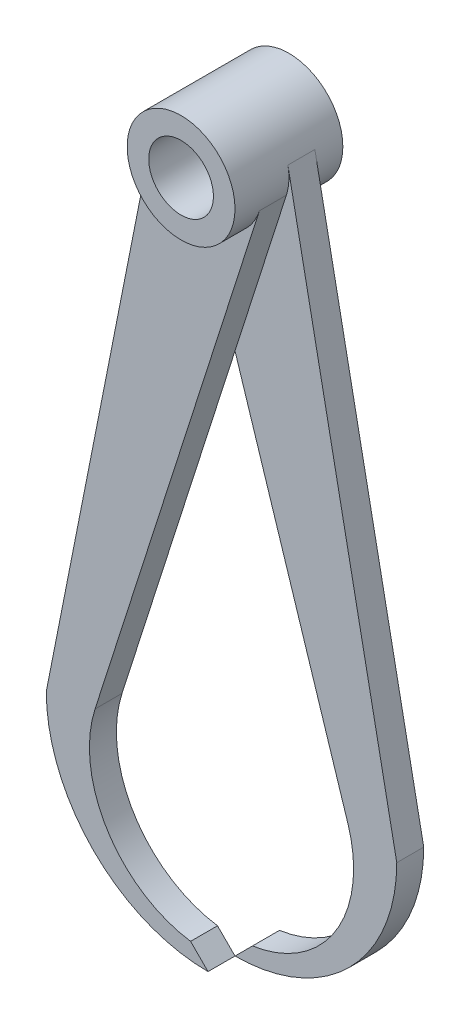
ISO-10303-21;
HEADER;
FILE_DESCRIPTION(('STEP AP214'),'2;1');
FILE_NAME('part.step','',(''),(''),'','','');
FILE_SCHEMA(('AUTOMOTIVE_DESIGN { 1 0 10303 214 1 1 1 1 }'));
ENDSEC;
DATA;
#1=APPLICATION_CONTEXT('core data for automotive mechanical design processes');
#2=APPLICATION_PROTOCOL_DEFINITION('international standard','automotive_design',2000,#1);
#3=PRODUCT_CONTEXT('',#1,'mechanical');
#4=PRODUCT('Part','Part','',(#3));
#5=PRODUCT_RELATED_PRODUCT_CATEGORY('part','',(#4));
#6=PRODUCT_DEFINITION_FORMATION('','',#4);
#7=PRODUCT_DEFINITION_CONTEXT('part definition',#1,'design');
#8=PRODUCT_DEFINITION('design','',#6,#7);
#9=PRODUCT_DEFINITION_SHAPE('','',#8);
#10=(LENGTH_UNIT() NAMED_UNIT(*) SI_UNIT(.MILLI.,.METRE.));
#11=(NAMED_UNIT(*) PLANE_ANGLE_UNIT() SI_UNIT($,.RADIAN.));
#12=(NAMED_UNIT(*) SI_UNIT($,.STERADIAN.) SOLID_ANGLE_UNIT());
#13=UNCERTAINTY_MEASURE_WITH_UNIT(LENGTH_MEASURE(1.E-05),#10,'distance_accuracy_value','');
#14=(GEOMETRIC_REPRESENTATION_CONTEXT(3) GLOBAL_UNCERTAINTY_ASSIGNED_CONTEXT((#13)) GLOBAL_UNIT_ASSIGNED_CONTEXT((#10,
#11,#12)) REPRESENTATION_CONTEXT('',''));
#15=CARTESIAN_POINT('',(0.,0.,0.));
#16=DIRECTION('',(0.,0.,1.));
#17=DIRECTION('',(1.,0.,0.));
#18=AXIS2_PLACEMENT_3D('',#15,#16,#17);
#19=CARTESIAN_POINT('',(65.,-65.0000000000001,-5.));
#20=DIRECTION('',(0.707106781186547,-0.707106781186548,0.));
#21=DIRECTION('',(0.707106781186548,0.707106781186547,0.));
#22=AXIS2_PLACEMENT_3D('',#19,#20,#21);
#23=PLANE('',#22);
#24=DIRECTION('',(0.707106781186548,0.707106781186547,0.));
#25=VECTOR('',#24,1.);
#26=CARTESIAN_POINT('',(65.,-65.0000000000001,0.));
#27=LINE('',#26,#25);
#28=CARTESIAN_POINT('',(0.,-130.,0.));
#29=VERTEX_POINT('',#28);
#30=CARTESIAN_POINT('',(3.23987041127394,-126.760129588726,0.));
#31=VERTEX_POINT('',#30);
#32=EDGE_CURVE('E141',#29,#31,#27,.T.);
#33=ORIENTED_EDGE('',*,*,#32,.T.);
#34=DIRECTION('',(0.,0.,1.));
#35=VECTOR('',#34,1.);
#36=CARTESIAN_POINT('',(3.23987041127394,-126.760129588726,-5.));
#37=LINE('',#36,#35);
#38=CARTESIAN_POINT('',(3.23987041127394,-126.760129588726,-5.));
#39=VERTEX_POINT('',#38);
#40=EDGE_CURVE('E12',#39,#31,#37,.T.);
#41=ORIENTED_EDGE('',*,*,#40,.F.);
#42=DIRECTION('',(0.707106781186548,0.707106781186547,0.));
#43=VECTOR('',#42,1.);
#44=CARTESIAN_POINT('',(65.,-65.0000000000001,-5.));
#45=LINE('',#44,#43);
#46=CARTESIAN_POINT('',(0.,-130.,-5.));
#47=VERTEX_POINT('',#46);
#48=EDGE_CURVE('E153',#47,#39,#45,.T.);
#49=ORIENTED_EDGE('',*,*,#48,.F.);
#50=DIRECTION('',(0.,0.,1.));
#51=VECTOR('',#50,1.);
#52=CARTESIAN_POINT('',(0.,-130.,-5.));
#53=LINE('',#52,#51);
#54=EDGE_CURVE('E59',#47,#29,#53,.T.);
#55=ORIENTED_EDGE('',*,*,#54,.T.);
#56=EDGE_LOOP('',(#33,#41,#49,#55));
#57=FACE_BOUND('',#56,.T.);
#58=ADVANCED_FACE('F56',(#57),#23,.F.);
#59=CARTESIAN_POINT('',(0.,-105.,-5.));
#60=DIRECTION('',(0.,0.,1.));
#61=DIRECTION('',(1.,0.,0.));
#62=AXIS2_PLACEMENT_3D('',#59,#60,#61);
#63=CYLINDRICAL_SURFACE('',#62,22.);
#64=CARTESIAN_POINT('',(0.,-105.,0.));
#65=DIRECTION('',(0.,0.,1.));
#66=DIRECTION('',(1.,0.,0.));
#67=AXIS2_PLACEMENT_3D('',#64,#65,#66);
#68=CIRCLE('',#67,22.);
#69=CARTESIAN_POINT('',(20.9534285452394,-98.2952380952381,0.));
#70=VERTEX_POINT('',#69);
#71=EDGE_CURVE('E93',#31,#70,#68,.T.);
#72=ORIENTED_EDGE('',*,*,#71,.T.);
#73=DIRECTION('',(0.,0.,1.));
#74=VECTOR('',#73,1.);
#75=CARTESIAN_POINT('',(20.9534285452394,-98.2952380952381,-5.));
#76=LINE('',#75,#74);
#77=CARTESIAN_POINT('',(20.9534285452394,-98.2952380952381,-5.));
#78=VERTEX_POINT('',#77);
#79=EDGE_CURVE('E65',#78,#70,#76,.T.);
#80=ORIENTED_EDGE('',*,*,#79,.F.);
#81=CARTESIAN_POINT('',(0.,-105.,-5.));
#82=DIRECTION('',(0.,0.,1.));
#83=DIRECTION('',(1.,0.,0.));
#84=AXIS2_PLACEMENT_3D('',#81,#82,#83);
#85=CIRCLE('',#84,22.);
#86=EDGE_CURVE('E73',#39,#78,#85,.T.);
#87=ORIENTED_EDGE('',*,*,#86,.F.);
#88=ORIENTED_EDGE('',*,*,#40,.T.);
#89=EDGE_LOOP('',(#72,#80,#87,#88));
#90=FACE_BOUND('',#89,.T.);
#91=ADVANCED_FACE('F173',(#90),#63,.F.);
#92=CARTESIAN_POINT('',(-9.52428570238155,-3.04761904761905,-5.));
#93=DIRECTION('',(0.952428570238155,0.304761904761905,0.));
#94=DIRECTION('',(-0.304761904761905,0.952428570238155,0.));
#95=AXIS2_PLACEMENT_3D('',#92,#93,#94);
#96=PLANE('',#95);
#97=DIRECTION('',(-0.304761904761905,0.952428570238155,0.));
#98=VECTOR('',#97,1.);
#99=CARTESIAN_POINT('',(-9.52428570238155,-3.04761904761905,0.));
#100=LINE('',#99,#98);
#101=CARTESIAN_POINT('',(-9.52428570238155,-3.04761904761905,0.));
#102=VERTEX_POINT('',#101);
#103=EDGE_CURVE('E126',#70,#102,#100,.T.);
#104=ORIENTED_EDGE('',*,*,#103,.T.);
#105=DIRECTION('',(0.,0.,1.));
#106=VECTOR('',#105,1.);
#107=CARTESIAN_POINT('',(-9.52428570238155,-3.04761904761905,-5.));
#108=LINE('',#107,#106);
#109=CARTESIAN_POINT('',(-9.52428570238155,-3.04761904761905,-5.));
#110=VERTEX_POINT('',#109);
#111=EDGE_CURVE('E124',#110,#102,#108,.T.);
#112=ORIENTED_EDGE('',*,*,#111,.F.);
#113=DIRECTION('',(-0.304761904761905,0.952428570238155,0.));
#114=VECTOR('',#113,1.);
#115=CARTESIAN_POINT('',(-9.52428570238155,-3.04761904761905,-5.));
#116=LINE('',#115,#114);
#117=EDGE_CURVE('E114',#78,#110,#116,.T.);
#118=ORIENTED_EDGE('',*,*,#117,.F.);
#119=ORIENTED_EDGE('',*,*,#79,.T.);
#120=EDGE_LOOP('',(#104,#112,#118,#119));
#121=FACE_BOUND('',#120,.T.);
#122=ADVANCED_FACE('F125',(#121),#96,.F.);
#123=CARTESIAN_POINT('',(0.,0.,-5.));
#124=DIRECTION('',(0.,0.,1.));
#125=DIRECTION('',(1.,0.,0.));
#126=AXIS2_PLACEMENT_3D('',#123,#124,#125);
#127=CYLINDRICAL_SURFACE('',#126,10.);
#128=CARTESIAN_POINT('',(0.,0.,0.));
#129=DIRECTION('',(0.,0.,1.));
#130=DIRECTION('',(1.,0.,0.));
#131=AXIS2_PLACEMENT_3D('',#128,#129,#130);
#132=CIRCLE('',#131,10.);
#133=CARTESIAN_POINT('',(9.80945398661768,1.9428361959853,0.));
#134=VERTEX_POINT('',#133);
#135=EDGE_CURVE('E150',#102,#134,#132,.T.);
#136=ORIENTED_EDGE('',*,*,#135,.T.);
#137=DIRECTION('',(0.,0.,1.));
#138=VECTOR('',#137,1.);
#139=CARTESIAN_POINT('',(9.80945398661768,1.9428361959853,-5.));
#140=LINE('',#139,#138);
#141=CARTESIAN_POINT('',(9.80945398661768,1.9428361959853,-5.));
#142=VERTEX_POINT('',#141);
#143=EDGE_CURVE('E130',#142,#134,#140,.T.);
#144=ORIENTED_EDGE('',*,*,#143,.F.);
#145=CARTESIAN_POINT('',(0.,0.,-5.));
#146=DIRECTION('',(0.,0.,1.));
#147=DIRECTION('',(1.,0.,0.));
#148=AXIS2_PLACEMENT_3D('',#145,#146,#147);
#149=CIRCLE('',#148,10.);
#150=EDGE_CURVE('E119',#110,#142,#149,.T.);
#151=ORIENTED_EDGE('',*,*,#150,.F.);
#152=ORIENTED_EDGE('',*,*,#111,.T.);
#153=EDGE_LOOP('',(#136,#144,#151,#152));
#154=FACE_BOUND('',#153,.T.);
#155=ADVANCED_FACE('F132',(#154),#127,.F.);
#156=CARTESIAN_POINT('',(9.80945398661768,1.9428361959853,-5.));
#157=DIRECTION('',(0.980945398661767,0.19428361959853,0.));
#158=DIRECTION('',(-0.19428361959853,0.980945398661767,0.));
#159=AXIS2_PLACEMENT_3D('',#156,#157,#158);
#160=PLANE('',#159);
#161=DIRECTION('',(-0.19428361959853,0.980945398661767,0.));
#162=VECTOR('',#161,1.);
#163=CARTESIAN_POINT('',(9.80945398661768,1.9428361959853,0.));
#164=LINE('',#163,#162);
#165=CARTESIAN_POINT('',(30.,-100.,0.));
#166=VERTEX_POINT('',#165);
#167=EDGE_CURVE('E147',#166,#134,#164,.T.);
#168=ORIENTED_EDGE('',*,*,#167,.F.);
#169=DIRECTION('',(0.,0.,1.));
#170=VECTOR('',#169,1.);
#171=CARTESIAN_POINT('',(30.,-100.,-5.));
#172=LINE('',#171,#170);
#173=CARTESIAN_POINT('',(30.,-100.,-5.));
#174=VERTEX_POINT('',#173);
#175=EDGE_CURVE('E156',#174,#166,#172,.T.);
#176=ORIENTED_EDGE('',*,*,#175,.F.);
#177=DIRECTION('',(-0.19428361959853,0.980945398661767,0.));
#178=VECTOR('',#177,1.);
#179=CARTESIAN_POINT('',(9.80945398661768,1.9428361959853,-5.));
#180=LINE('',#179,#178);
#181=EDGE_CURVE('E134',#174,#142,#180,.T.);
#182=ORIENTED_EDGE('',*,*,#181,.T.);
#183=ORIENTED_EDGE('',*,*,#143,.T.);
#184=EDGE_LOOP('',(#168,#176,#182,#183));
#185=FACE_BOUND('',#184,.T.);
#186=ADVANCED_FACE('F164',(#185),#160,.T.);
#187=CARTESIAN_POINT('',(0.,-100.,-5.));
#188=DIRECTION('',(0.,0.,1.));
#189=DIRECTION('',(1.,0.,0.));
#190=AXIS2_PLACEMENT_3D('',#187,#188,#189);
#191=CYLINDRICAL_SURFACE('',#190,30.);
#192=CARTESIAN_POINT('',(0.,-100.,0.));
#193=DIRECTION('',(0.,0.,1.));
#194=DIRECTION('',(1.,0.,0.));
#195=AXIS2_PLACEMENT_3D('',#192,#193,#194);
#196=CIRCLE('',#195,30.);
#197=EDGE_CURVE('E144',#29,#166,#196,.T.);
#198=ORIENTED_EDGE('',*,*,#197,.F.);
#199=ORIENTED_EDGE('',*,*,#54,.F.);
#200=CARTESIAN_POINT('',(0.,-100.,-5.));
#201=DIRECTION('',(0.,0.,1.));
#202=DIRECTION('',(1.,0.,0.));
#203=AXIS2_PLACEMENT_3D('',#200,#201,#202);
#204=CIRCLE('',#203,30.);
#205=EDGE_CURVE('E136',#47,#174,#204,.T.);
#206=ORIENTED_EDGE('',*,*,#205,.T.);
#207=ORIENTED_EDGE('',*,*,#175,.T.);
#208=EDGE_LOOP('',(#198,#199,#206,#207));
#209=FACE_BOUND('',#208,.T.);
#210=ADVANCED_FACE('F162',(#209),#191,.T.);
#211=CARTESIAN_POINT('',(0.,0.,-5.));
#212=DIRECTION('',(0.,0.,1.));
#213=DIRECTION('',(1.,0.,0.));
#214=AXIS2_PLACEMENT_3D('',#211,#212,#213);
#215=PLANE('',#214);
#216=ORIENTED_EDGE('',*,*,#48,.T.);
#217=ORIENTED_EDGE('',*,*,#86,.T.);
#218=ORIENTED_EDGE('',*,*,#117,.T.);
#219=ORIENTED_EDGE('',*,*,#150,.T.);
#220=ORIENTED_EDGE('',*,*,#181,.F.);
#221=ORIENTED_EDGE('',*,*,#205,.F.);
#222=EDGE_LOOP('',(#216,#217,#218,#219,#220,#221));
#223=FACE_BOUND('',#222,.T.);
#224=ADVANCED_FACE('F116',(#223),#215,.F.);
#225=CARTESIAN_POINT('',(0.,0.,0.));
#226=DIRECTION('',(0.,0.,1.));
#227=DIRECTION('',(1.,0.,0.));
#228=AXIS2_PLACEMENT_3D('',#225,#226,#227);
#229=PLANE('',#228);
#230=ORIENTED_EDGE('',*,*,#32,.F.);
#231=ORIENTED_EDGE('',*,*,#197,.T.);
#232=ORIENTED_EDGE('',*,*,#167,.T.);
#233=ORIENTED_EDGE('',*,*,#135,.F.);
#234=ORIENTED_EDGE('',*,*,#103,.F.);
#235=ORIENTED_EDGE('',*,*,#71,.F.);
#236=EDGE_LOOP('',(#230,#231,#232,#233,#234,#235));
#237=FACE_BOUND('',#236,.T.);
#238=ADVANCED_FACE('F161',(#237),#229,.T.);
#239=CLOSED_SHELL('',(#58,#91,#122,#155,#186,#210,#224,#238));
#240=MANIFOLD_SOLID_BREP('B2',#239);
#241=CARTESIAN_POINT('',(0.,-105.,5.));
#242=DIRECTION('',(0.,0.,-1.));
#243=DIRECTION('',(-1.,0.,0.));
#244=AXIS2_PLACEMENT_3D('',#241,#242,#243);
#245=CYLINDRICAL_SURFACE('',#244,22.);
#246=CARTESIAN_POINT('',(0.,-105.,0.));
#247=DIRECTION('',(0.,0.,1.));
#248=DIRECTION('',(1.,0.,0.));
#249=AXIS2_PLACEMENT_3D('',#246,#247,#248);
#250=CIRCLE('',#249,22.);
#251=CARTESIAN_POINT('',(-20.9534285452394,-98.2952380952381,0.));
#252=VERTEX_POINT('',#251);
#253=CARTESIAN_POINT('',(-3.23987041127394,-126.760129588726,0.));
#254=VERTEX_POINT('',#253);
#255=EDGE_CURVE('E349',#252,#254,#250,.T.);
#256=ORIENTED_EDGE('',*,*,#255,.F.);
#257=DIRECTION('',(0.,0.,-1.));
#258=VECTOR('',#257,1.);
#259=CARTESIAN_POINT('',(-20.9534285452394,-98.2952380952381,5.));
#260=LINE('',#259,#258);
#261=CARTESIAN_POINT('',(-20.9534285452394,-98.2952380952381,5.));
#262=VERTEX_POINT('',#261);
#263=EDGE_CURVE('E54',#262,#252,#260,.T.);
#264=ORIENTED_EDGE('',*,*,#263,.F.);
#265=CARTESIAN_POINT('',(0.,-105.,5.));
#266=DIRECTION('',(0.,0.,1.));
#267=DIRECTION('',(1.,0.,0.));
#268=AXIS2_PLACEMENT_3D('',#265,#266,#267);
#269=CIRCLE('',#268,22.);
#270=CARTESIAN_POINT('',(-3.23987041127394,-126.760129588726,5.));
#271=VERTEX_POINT('',#270);
#272=EDGE_CURVE('E368',#262,#271,#269,.T.);
#273=ORIENTED_EDGE('',*,*,#272,.T.);
#274=DIRECTION('',(0.,0.,-1.));
#275=VECTOR('',#274,1.);
#276=CARTESIAN_POINT('',(-3.23987041127394,-126.760129588726,5.));
#277=LINE('',#276,#275);
#278=EDGE_CURVE('E306',#271,#254,#277,.T.);
#279=ORIENTED_EDGE('',*,*,#278,.T.);
#280=EDGE_LOOP('',(#256,#264,#273,#279));
#281=FACE_BOUND('',#280,.T.);
#282=ADVANCED_FACE('F261',(#281),#245,.F.);
#283=CARTESIAN_POINT('',(9.52428570238155,-3.04761904761905,5.));
#284=DIRECTION('',(-0.952428570238155,0.304761904761905,0.));
#285=DIRECTION('',(-0.304761904761905,-0.952428570238155,0.));
#286=AXIS2_PLACEMENT_3D('',#283,#284,#285);
#287=PLANE('',#286);
#288=DIRECTION('',(0.304761904761905,0.952428570238155,0.));
#289=VECTOR('',#288,1.);
#290=CARTESIAN_POINT('',(9.52428570238155,-3.04761904761905,0.));
#291=LINE('',#290,#289);
#292=CARTESIAN_POINT('',(9.52428570238156,-3.04761904761905,0.));
#293=VERTEX_POINT('',#292);
#294=EDGE_CURVE('E353',#252,#293,#291,.T.);
#295=ORIENTED_EDGE('',*,*,#294,.T.);
#296=DIRECTION('',(0.,0.,-1.));
#297=VECTOR('',#296,1.);
#298=CARTESIAN_POINT('',(9.52428570238156,-3.04761904761905,5.));
#299=LINE('',#298,#297);
#300=CARTESIAN_POINT('',(9.52428570238156,-3.04761904761905,5.));
#301=VERTEX_POINT('',#300);
#302=EDGE_CURVE('E270',#301,#293,#299,.T.);
#303=ORIENTED_EDGE('',*,*,#302,.F.);
#304=DIRECTION('',(0.304761904761905,0.952428570238155,0.));
#305=VECTOR('',#304,1.);
#306=CARTESIAN_POINT('',(9.52428570238155,-3.04761904761905,5.));
#307=LINE('',#306,#305);
#308=EDGE_CURVE('E343',#262,#301,#307,.T.);
#309=ORIENTED_EDGE('',*,*,#308,.F.);
#310=ORIENTED_EDGE('',*,*,#263,.T.);
#311=EDGE_LOOP('',(#295,#303,#309,#310));
#312=FACE_BOUND('',#311,.T.);
#313=ADVANCED_FACE('F381',(#312),#287,.F.);
#314=CARTESIAN_POINT('',(0.,0.,5.));
#315=DIRECTION('',(0.,0.,-1.));
#316=DIRECTION('',(-1.,0.,0.));
#317=AXIS2_PLACEMENT_3D('',#314,#315,#316);
#318=CYLINDRICAL_SURFACE('',#317,10.);
#319=CARTESIAN_POINT('',(0.,0.,0.));
#320=DIRECTION('',(0.,0.,1.));
#321=DIRECTION('',(1.,0.,0.));
#322=AXIS2_PLACEMENT_3D('',#319,#320,#321);
#323=CIRCLE('',#322,10.);
#324=CARTESIAN_POINT('',(-9.80945398661768,1.9428361959853,0.));
#325=VERTEX_POINT('',#324);
#326=EDGE_CURVE('E357',#325,#293,#323,.T.);
#327=ORIENTED_EDGE('',*,*,#326,.F.);
#328=DIRECTION('',(0.,0.,-1.));
#329=VECTOR('',#328,1.);
#330=CARTESIAN_POINT('',(-9.80945398661768,1.9428361959853,5.));
#331=LINE('',#330,#329);
#332=CARTESIAN_POINT('',(-9.80945398661768,1.9428361959853,5.));
#333=VERTEX_POINT('',#332);
#334=EDGE_CURVE('E329',#333,#325,#331,.T.);
#335=ORIENTED_EDGE('',*,*,#334,.F.);
#336=CARTESIAN_POINT('',(0.,0.,5.));
#337=DIRECTION('',(0.,0.,1.));
#338=DIRECTION('',(1.,0.,0.));
#339=AXIS2_PLACEMENT_3D('',#336,#337,#338);
#340=CIRCLE('',#339,10.);
#341=EDGE_CURVE('E339',#333,#301,#340,.T.);
#342=ORIENTED_EDGE('',*,*,#341,.T.);
#343=ORIENTED_EDGE('',*,*,#302,.T.);
#344=EDGE_LOOP('',(#327,#335,#342,#343));
#345=FACE_BOUND('',#344,.T.);
#346=ADVANCED_FACE('F378',(#345),#318,.F.);
#347=CARTESIAN_POINT('',(-9.80945398661768,1.9428361959853,5.));
#348=DIRECTION('',(-0.980945398661767,0.19428361959853,0.));
#349=DIRECTION('',(-0.19428361959853,-0.980945398661767,0.));
#350=AXIS2_PLACEMENT_3D('',#347,#348,#349);
#351=PLANE('',#350);
#352=DIRECTION('',(0.19428361959853,0.980945398661767,0.));
#353=VECTOR('',#352,1.);
#354=CARTESIAN_POINT('',(-9.80945398661768,1.9428361959853,0.));
#355=LINE('',#354,#353);
#356=CARTESIAN_POINT('',(-30.,-99.9999999999999,0.));
#357=VERTEX_POINT('',#356);
#358=EDGE_CURVE('E327',#357,#325,#355,.T.);
#359=ORIENTED_EDGE('',*,*,#358,.F.);
#360=DIRECTION('',(0.,0.,-1.));
#361=VECTOR('',#360,1.);
#362=CARTESIAN_POINT('',(-30.,-99.9999999999999,5.));
#363=LINE('',#362,#361);
#364=CARTESIAN_POINT('',(-30.,-99.9999999999999,5.));
#365=VERTEX_POINT('',#364);
#366=EDGE_CURVE('E321',#365,#357,#363,.T.);
#367=ORIENTED_EDGE('',*,*,#366,.F.);
#368=DIRECTION('',(0.19428361959853,0.980945398661767,0.));
#369=VECTOR('',#368,1.);
#370=CARTESIAN_POINT('',(-9.80945398661768,1.9428361959853,5.));
#371=LINE('',#370,#369);
#372=EDGE_CURVE('E325',#365,#333,#371,.T.);
#373=ORIENTED_EDGE('',*,*,#372,.T.);
#374=ORIENTED_EDGE('',*,*,#334,.T.);
#375=EDGE_LOOP('',(#359,#367,#373,#374));
#376=FACE_BOUND('',#375,.T.);
#377=ADVANCED_FACE('F323',(#376),#351,.T.);
#378=CARTESIAN_POINT('',(0.,-100.,5.));
#379=DIRECTION('',(0.,0.,-1.));
#380=DIRECTION('',(-1.,0.,0.));
#381=AXIS2_PLACEMENT_3D('',#378,#379,#380);
#382=CYLINDRICAL_SURFACE('',#381,30.);
#383=CARTESIAN_POINT('',(0.,-100.,0.));
#384=DIRECTION('',(0.,0.,1.));
#385=DIRECTION('',(1.,0.,0.));
#386=AXIS2_PLACEMENT_3D('',#383,#384,#385);
#387=CIRCLE('',#386,30.);
#388=CARTESIAN_POINT('',(0.,-130.,0.));
#389=VERTEX_POINT('',#388);
#390=EDGE_CURVE('E299',#357,#389,#387,.T.);
#391=ORIENTED_EDGE('',*,*,#390,.T.);
#392=DIRECTION('',(0.,0.,-1.));
#393=VECTOR('',#392,1.);
#394=CARTESIAN_POINT('',(0.,-130.,5.));
#395=LINE('',#394,#393);
#396=CARTESIAN_POINT('',(0.,-130.,5.));
#397=VERTEX_POINT('',#396);
#398=EDGE_CURVE('E330',#397,#389,#395,.T.);
#399=ORIENTED_EDGE('',*,*,#398,.F.);
#400=CARTESIAN_POINT('',(0.,-100.,5.));
#401=DIRECTION('',(0.,0.,1.));
#402=DIRECTION('',(1.,0.,0.));
#403=AXIS2_PLACEMENT_3D('',#400,#401,#402);
#404=CIRCLE('',#403,30.);
#405=EDGE_CURVE('E332',#365,#397,#404,.T.);
#406=ORIENTED_EDGE('',*,*,#405,.F.);
#407=ORIENTED_EDGE('',*,*,#366,.T.);
#408=EDGE_LOOP('',(#391,#399,#406,#407));
#409=FACE_BOUND('',#408,.T.);
#410=ADVANCED_FACE('F333',(#409),#382,.T.);
#411=CARTESIAN_POINT('',(-65.,-65.,5.));
#412=DIRECTION('',(-0.707106781186547,-0.707106781186548,0.));
#413=DIRECTION('',(0.707106781186548,-0.707106781186547,0.));
#414=AXIS2_PLACEMENT_3D('',#411,#412,#413);
#415=PLANE('',#414);
#416=DIRECTION('',(-0.707106781186548,0.707106781186547,0.));
#417=VECTOR('',#416,1.);
#418=CARTESIAN_POINT('',(-65.,-65.,0.));
#419=LINE('',#418,#417);
#420=EDGE_CURVE('E365',#389,#254,#419,.T.);
#421=ORIENTED_EDGE('',*,*,#420,.T.);
#422=ORIENTED_EDGE('',*,*,#278,.F.);
#423=DIRECTION('',(-0.707106781186548,0.707106781186547,0.));
#424=VECTOR('',#423,1.);
#425=CARTESIAN_POINT('',(-65.,-65.,5.));
#426=LINE('',#425,#424);
#427=EDGE_CURVE('E278',#397,#271,#426,.T.);
#428=ORIENTED_EDGE('',*,*,#427,.F.);
#429=ORIENTED_EDGE('',*,*,#398,.T.);
#430=EDGE_LOOP('',(#421,#422,#428,#429));
#431=FACE_BOUND('',#430,.T.);
#432=ADVANCED_FACE('F386',(#431),#415,.F.);
#433=CARTESIAN_POINT('',(0.,0.,5.));
#434=DIRECTION('',(0.,0.,1.));
#435=DIRECTION('',(1.,0.,0.));
#436=AXIS2_PLACEMENT_3D('',#433,#434,#435);
#437=PLANE('',#436);
#438=ORIENTED_EDGE('',*,*,#272,.F.);
#439=ORIENTED_EDGE('',*,*,#308,.T.);
#440=ORIENTED_EDGE('',*,*,#341,.F.);
#441=ORIENTED_EDGE('',*,*,#372,.F.);
#442=ORIENTED_EDGE('',*,*,#405,.T.);
#443=ORIENTED_EDGE('',*,*,#427,.T.);
#444=EDGE_LOOP('',(#438,#439,#440,#441,#442,#443));
#445=FACE_BOUND('',#444,.T.);
#446=ADVANCED_FACE('F337',(#445),#437,.T.);
#447=CARTESIAN_POINT('',(0.,0.,0.));
#448=DIRECTION('',(0.,0.,1.));
#449=DIRECTION('',(1.,0.,0.));
#450=AXIS2_PLACEMENT_3D('',#447,#448,#449);
#451=PLANE('',#450);
#452=ORIENTED_EDGE('',*,*,#255,.T.);
#453=ORIENTED_EDGE('',*,*,#420,.F.);
#454=ORIENTED_EDGE('',*,*,#390,.F.);
#455=ORIENTED_EDGE('',*,*,#358,.T.);
#456=ORIENTED_EDGE('',*,*,#326,.T.);
#457=ORIENTED_EDGE('',*,*,#294,.F.);
#458=EDGE_LOOP('',(#452,#453,#454,#455,#456,#457));
#459=FACE_BOUND('',#458,.T.);
#460=ADVANCED_FACE('F383',(#459),#451,.F.);
#461=CLOSED_SHELL('',(#282,#313,#346,#377,#410,#432,#446,#460));
#462=MANIFOLD_SOLID_BREP('B6',#461);
#463=CARTESIAN_POINT('',(0.,0.,10.));
#464=DIRECTION('',(0.,0.,-1.));
#465=DIRECTION('',(-1.,0.,0.));
#466=AXIS2_PLACEMENT_3D('',#463,#464,#465);
#467=CYLINDRICAL_SURFACE('',#466,6.);
#468=CARTESIAN_POINT('',(0.,0.,10.));
#469=DIRECTION('',(0.,0.,1.));
#470=DIRECTION('',(1.,0.,0.));
#471=AXIS2_PLACEMENT_3D('',#468,#469,#470);
#472=CIRCLE('',#471,6.);
#473=CARTESIAN_POINT('',(6.,0.,10.));
#474=VERTEX_POINT('',#473);
#475=EDGE_CURVE('E484',#474,#474,#472,.T.);
#476=ORIENTED_EDGE('',*,*,#475,.T.);
#477=EDGE_LOOP('',(#476));
#478=FACE_BOUND('',#477,.T.);
#479=CARTESIAN_POINT('',(0.,0.,-10.));
#480=DIRECTION('',(0.,0.,1.));
#481=DIRECTION('',(1.,0.,0.));
#482=AXIS2_PLACEMENT_3D('',#479,#480,#481);
#483=CIRCLE('',#482,6.);
#484=CARTESIAN_POINT('',(6.,0.,-10.));
#485=VERTEX_POINT('',#484);
#486=EDGE_CURVE('E490',#485,#485,#483,.T.);
#487=ORIENTED_EDGE('',*,*,#486,.F.);
#488=EDGE_LOOP('',(#487));
#489=FACE_BOUND('',#488,.T.);
#490=ADVANCED_FACE('F477',(#478,#489),#467,.F.);
#491=CARTESIAN_POINT('',(0.,0.,10.));
#492=DIRECTION('',(0.,0.,-1.));
#493=DIRECTION('',(-1.,0.,0.));
#494=AXIS2_PLACEMENT_3D('',#491,#492,#493);
#495=CYLINDRICAL_SURFACE('',#494,10.);
#496=CARTESIAN_POINT('',(0.,0.,10.));
#497=DIRECTION('',(0.,0.,1.));
#498=DIRECTION('',(1.,0.,0.));
#499=AXIS2_PLACEMENT_3D('',#496,#497,#498);
#500=CIRCLE('',#499,10.);
#501=CARTESIAN_POINT('',(10.,0.,10.));
#502=VERTEX_POINT('',#501);
#503=EDGE_CURVE('E260',#502,#502,#500,.T.);
#504=ORIENTED_EDGE('',*,*,#503,.F.);
#505=EDGE_LOOP('',(#504));
#506=FACE_BOUND('',#505,.T.);
#507=CARTESIAN_POINT('',(0.,0.,-10.));
#508=DIRECTION('',(0.,0.,1.));
#509=DIRECTION('',(1.,0.,0.));
#510=AXIS2_PLACEMENT_3D('',#507,#508,#509);
#511=CIRCLE('',#510,10.);
#512=CARTESIAN_POINT('',(10.,0.,-10.));
#513=VERTEX_POINT('',#512);
#514=EDGE_CURVE('E480',#513,#513,#511,.T.);
#515=ORIENTED_EDGE('',*,*,#514,.T.);
#516=EDGE_LOOP('',(#515));
#517=FACE_BOUND('',#516,.T.);
#518=ADVANCED_FACE('F497',(#506,#517),#495,.T.);
#519=CARTESIAN_POINT('',(0.,0.,10.));
#520=DIRECTION('',(0.,0.,1.));
#521=DIRECTION('',(1.,0.,0.));
#522=AXIS2_PLACEMENT_3D('',#519,#520,#521);
#523=PLANE('',#522);
#524=ORIENTED_EDGE('',*,*,#475,.F.);
#525=EDGE_LOOP('',(#524));
#526=FACE_BOUND('',#525,.T.);
#527=ORIENTED_EDGE('',*,*,#503,.T.);
#528=EDGE_LOOP('',(#527));
#529=FACE_BOUND('',#528,.T.);
#530=ADVANCED_FACE('F501',(#526,#529),#523,.T.);
#531=CARTESIAN_POINT('',(0.,0.,-10.));
#532=DIRECTION('',(0.,0.,1.));
#533=DIRECTION('',(1.,0.,0.));
#534=AXIS2_PLACEMENT_3D('',#531,#532,#533);
#535=PLANE('',#534);
#536=ORIENTED_EDGE('',*,*,#486,.T.);
#537=EDGE_LOOP('',(#536));
#538=FACE_BOUND('',#537,.T.);
#539=ORIENTED_EDGE('',*,*,#514,.F.);
#540=EDGE_LOOP('',(#539));
#541=FACE_BOUND('',#540,.T.);
#542=ADVANCED_FACE('F499',(#538,#541),#535,.F.);
#543=CLOSED_SHELL('',(#490,#518,#530,#542));
#544=MANIFOLD_SOLID_BREP('B48',#543);
#545=ADVANCED_BREP_SHAPE_REPRESENTATION('',(#18,#240,#462,#544),#14);
#546=SHAPE_DEFINITION_REPRESENTATION(#9,#545);
ENDSEC;
END-ISO-10303-21;
